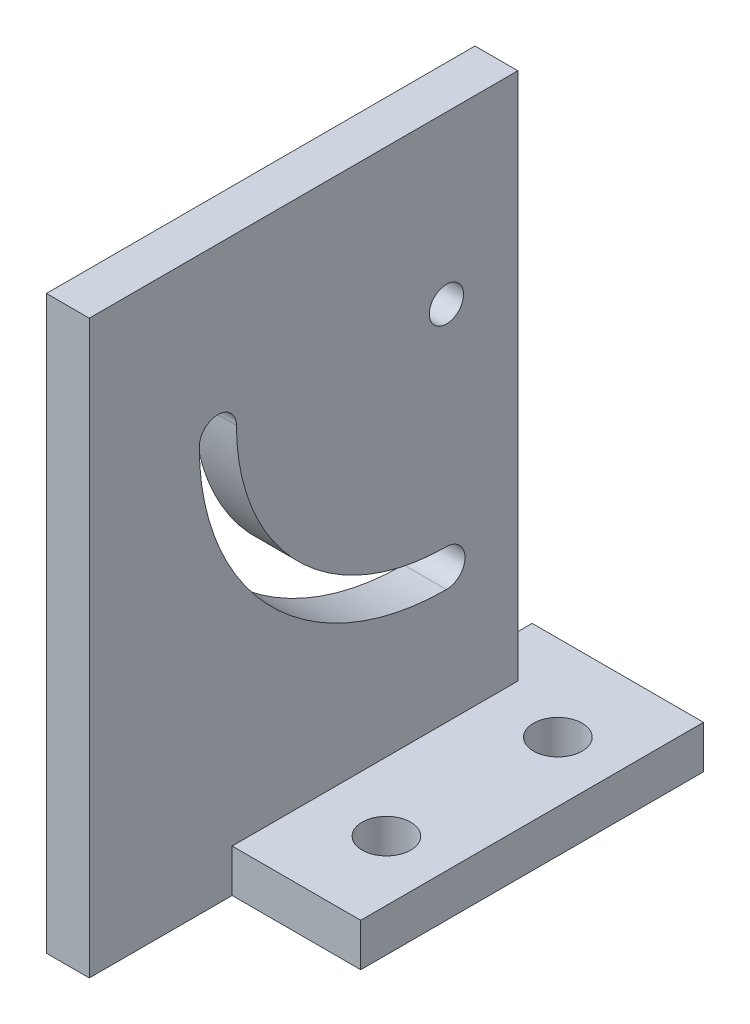
ISO-10303-21;
HEADER;
FILE_DESCRIPTION(('STEP AP214'),'2;1');
FILE_NAME('part.step','',(''),(''),'','','');
FILE_SCHEMA(('AUTOMOTIVE_DESIGN { 1 0 10303 214 1 1 1 1 }'));
ENDSEC;
DATA;
#1=APPLICATION_CONTEXT('core data for automotive mechanical design processes');
#2=APPLICATION_PROTOCOL_DEFINITION('international standard','automotive_design',2000,#1);
#3=PRODUCT_CONTEXT('',#1,'mechanical');
#4=PRODUCT('Part','Part','',(#3));
#5=PRODUCT_RELATED_PRODUCT_CATEGORY('part','',(#4));
#6=PRODUCT_DEFINITION_FORMATION('','',#4);
#7=PRODUCT_DEFINITION_CONTEXT('part definition',#1,'design');
#8=PRODUCT_DEFINITION('design','',#6,#7);
#9=PRODUCT_DEFINITION_SHAPE('','',#8);
#10=(LENGTH_UNIT() NAMED_UNIT(*) SI_UNIT(.MILLI.,.METRE.));
#11=(NAMED_UNIT(*) PLANE_ANGLE_UNIT() SI_UNIT($,.RADIAN.));
#12=(NAMED_UNIT(*) SI_UNIT($,.STERADIAN.) SOLID_ANGLE_UNIT());
#13=UNCERTAINTY_MEASURE_WITH_UNIT(LENGTH_MEASURE(1.E-05),#10,'distance_accuracy_value','');
#14=(GEOMETRIC_REPRESENTATION_CONTEXT(3) GLOBAL_UNCERTAINTY_ASSIGNED_CONTEXT((#13)) GLOBAL_UNIT_ASSIGNED_CONTEXT((#10,
#11,#12)) REPRESENTATION_CONTEXT('',''));
#15=CARTESIAN_POINT('',(0.,0.,0.));
#16=DIRECTION('',(0.,0.,1.));
#17=DIRECTION('',(1.,0.,0.));
#18=AXIS2_PLACEMENT_3D('',#15,#16,#17);
#19=CARTESIAN_POINT('',(18.,-13.,14.));
#20=DIRECTION('',(0.,1.,0.));
#21=DIRECTION('',(1.,0.,0.));
#22=AXIS2_PLACEMENT_3D('',#19,#20,#21);
#23=CYLINDRICAL_SURFACE('',#22,1.7);
#24=CARTESIAN_POINT('',(18.,-15.,14.));
#25=DIRECTION('',(0.,1.,0.));
#26=DIRECTION('',(1.,0.,0.));
#27=AXIS2_PLACEMENT_3D('',#24,#25,#26);
#28=CIRCLE('',#27,1.7);
#29=CARTESIAN_POINT('',(19.7,-15.,14.));
#30=VERTEX_POINT('',#29);
#31=EDGE_CURVE('E266',#30,#30,#28,.T.);
#32=ORIENTED_EDGE('',*,*,#31,.T.);
#33=DIRECTION('',(0.,-1.,0.));
#34=VECTOR('',#33,1.);
#35=CARTESIAN_POINT('',(19.7,-13.,14.));
#36=LINE('',#35,#34);
#37=CARTESIAN_POINT('',(19.7,-18.,14.));
#38=VERTEX_POINT('',#37);
#39=EDGE_CURVE('E9',#30,#38,#36,.T.);
#40=ORIENTED_EDGE('',*,*,#39,.T.);
#41=CARTESIAN_POINT('',(18.,-18.,14.));
#42=DIRECTION('',(0.,1.,0.));
#43=DIRECTION('',(1.,0.,0.));
#44=AXIS2_PLACEMENT_3D('',#41,#42,#43);
#45=CIRCLE('',#44,1.7);
#46=EDGE_CURVE('E217',#38,#38,#45,.T.);
#47=ORIENTED_EDGE('',*,*,#46,.F.);
#48=ORIENTED_EDGE('',*,*,#39,.F.);
#49=EDGE_LOOP('',(#32,#40,#47,#48));
#50=FACE_BOUND('',#49,.T.);
#51=ADVANCED_FACE('F15',(#50),#23,.F.);
#52=CARTESIAN_POINT('',(18.,-13.,2.));
#53=DIRECTION('',(0.,1.,0.));
#54=DIRECTION('',(1.,0.,0.));
#55=AXIS2_PLACEMENT_3D('',#52,#53,#54);
#56=CYLINDRICAL_SURFACE('',#55,1.7);
#57=CARTESIAN_POINT('',(18.,-15.,2.));
#58=DIRECTION('',(0.,1.,0.));
#59=DIRECTION('',(1.,0.,0.));
#60=AXIS2_PLACEMENT_3D('',#57,#58,#59);
#61=CIRCLE('',#60,1.7);
#62=CARTESIAN_POINT('',(19.7,-15.,2.));
#63=VERTEX_POINT('',#62);
#64=EDGE_CURVE('E262',#63,#63,#61,.T.);
#65=ORIENTED_EDGE('',*,*,#64,.T.);
#66=DIRECTION('',(0.,-1.,0.));
#67=VECTOR('',#66,1.);
#68=CARTESIAN_POINT('',(19.7,-13.,2.));
#69=LINE('',#68,#67);
#70=CARTESIAN_POINT('',(19.7,-18.,2.));
#71=VERTEX_POINT('',#70);
#72=EDGE_CURVE('E23',#63,#71,#69,.T.);
#73=ORIENTED_EDGE('',*,*,#72,.T.);
#74=CARTESIAN_POINT('',(18.,-18.,2.));
#75=DIRECTION('',(0.,1.,0.));
#76=DIRECTION('',(1.,0.,0.));
#77=AXIS2_PLACEMENT_3D('',#74,#75,#76);
#78=CIRCLE('',#77,1.7);
#79=EDGE_CURVE('E213',#71,#71,#78,.T.);
#80=ORIENTED_EDGE('',*,*,#79,.F.);
#81=ORIENTED_EDGE('',*,*,#72,.F.);
#82=EDGE_LOOP('',(#65,#73,#80,#81));
#83=FACE_BOUND('',#82,.T.);
#84=ADVANCED_FACE('F299',(#83),#56,.F.);
#85=CARTESIAN_POINT('',(22.2,-18.,-4.));
#86=DIRECTION('',(1.,0.,0.));
#87=DIRECTION('',(0.,1.,0.));
#88=AXIS2_PLACEMENT_3D('',#85,#86,#87);
#89=PLANE('',#88);
#90=DIRECTION('',(0.,0.,1.));
#91=VECTOR('',#90,1.);
#92=CARTESIAN_POINT('',(22.2,-18.,-4.));
#93=LINE('',#92,#91);
#94=CARTESIAN_POINT('',(22.2,-18.,-4.));
#95=VERTEX_POINT('',#94);
#96=CARTESIAN_POINT('',(22.2,-18.,20.));
#97=VERTEX_POINT('',#96);
#98=EDGE_CURVE('E202',#95,#97,#93,.T.);
#99=ORIENTED_EDGE('',*,*,#98,.F.);
#100=DIRECTION('',(0.,1.,0.));
#101=VECTOR('',#100,1.);
#102=CARTESIAN_POINT('',(22.2,-18.,-4.));
#103=LINE('',#102,#101);
#104=CARTESIAN_POINT('',(22.2,-15.,-4.));
#105=VERTEX_POINT('',#104);
#106=EDGE_CURVE('E230',#95,#105,#103,.T.);
#107=ORIENTED_EDGE('',*,*,#106,.T.);
#108=DIRECTION('',(0.,0.,1.));
#109=VECTOR('',#108,1.);
#110=CARTESIAN_POINT('',(22.2,-15.,-4.));
#111=LINE('',#110,#109);
#112=CARTESIAN_POINT('',(22.2,-15.,20.));
#113=VERTEX_POINT('',#112);
#114=EDGE_CURVE('E247',#105,#113,#111,.T.);
#115=ORIENTED_EDGE('',*,*,#114,.T.);
#116=DIRECTION('',(0.,1.,0.));
#117=VECTOR('',#116,1.);
#118=CARTESIAN_POINT('',(22.2,-18.,20.));
#119=LINE('',#118,#117);
#120=EDGE_CURVE('E293',#97,#113,#119,.T.);
#121=ORIENTED_EDGE('',*,*,#120,.F.);
#122=EDGE_LOOP('',(#99,#107,#115,#121));
#123=FACE_BOUND('',#122,.T.);
#124=ADVANCED_FACE('F367',(#123),#89,.T.);
#125=CARTESIAN_POINT('',(10.2,-18.,20.));
#126=DIRECTION('',(0.,0.,1.));
#127=DIRECTION('',(1.,0.,0.));
#128=AXIS2_PLACEMENT_3D('',#125,#126,#127);
#129=PLANE('',#128);
#130=DIRECTION('',(1.,0.,0.));
#131=VECTOR('',#130,1.);
#132=CARTESIAN_POINT('',(10.2,-15.,20.));
#133=LINE('',#132,#131);
#134=CARTESIAN_POINT('',(13.2,-15.,20.));
#135=VERTEX_POINT('',#134);
#136=EDGE_CURVE('E258',#135,#113,#133,.T.);
#137=ORIENTED_EDGE('',*,*,#136,.F.);
#138=DIRECTION('',(0.,-1.,0.));
#139=VECTOR('',#138,1.);
#140=CARTESIAN_POINT('',(13.2,-18.,20.));
#141=LINE('',#140,#139);
#142=CARTESIAN_POINT('',(13.2,-18.,20.));
#143=VERTEX_POINT('',#142);
#144=EDGE_CURVE('E290',#135,#143,#141,.T.);
#145=ORIENTED_EDGE('',*,*,#144,.T.);
#146=DIRECTION('',(1.,0.,0.));
#147=VECTOR('',#146,1.);
#148=CARTESIAN_POINT('',(10.2,-18.,20.));
#149=LINE('',#148,#147);
#150=EDGE_CURVE('E197',#143,#97,#149,.T.);
#151=ORIENTED_EDGE('',*,*,#150,.T.);
#152=ORIENTED_EDGE('',*,*,#120,.T.);
#153=EDGE_LOOP('',(#137,#145,#151,#152));
#154=FACE_BOUND('',#153,.T.);
#155=ADVANCED_FACE('F370',(#154),#129,.T.);
#156=CARTESIAN_POINT('',(13.2,-18.,0.));
#157=DIRECTION('',(1.,0.,0.));
#158=DIRECTION('',(0.,1.,0.));
#159=AXIS2_PLACEMENT_3D('',#156,#157,#158);
#160=PLANE('',#159);
#161=CARTESIAN_POINT('',(13.2,-5.65,5.));
#162=DIRECTION('',(-1.,0.,0.));
#163=DIRECTION('',(0.,1.,0.));
#164=AXIS2_PLACEMENT_3D('',#161,#162,#163);
#165=CIRCLE('',#164,1.3);
#166=CARTESIAN_POINT('',(13.2,-4.35,5.));
#167=VERTEX_POINT('',#166);
#168=CARTESIAN_POINT('',(13.2,-6.95,5.));
#169=VERTEX_POINT('',#168);
#170=EDGE_CURVE('E281',#167,#169,#165,.T.);
#171=ORIENTED_EDGE('',*,*,#170,.T.);
#172=CARTESIAN_POINT('',(13.2,10.35,5.));
#173=DIRECTION('',(-1.,0.,0.));
#174=DIRECTION('',(0.,0.,1.));
#175=AXIS2_PLACEMENT_3D('',#172,#173,#174);
#176=CIRCLE('',#175,17.3);
#177=CARTESIAN_POINT('',(13.2,10.35,22.3));
#178=VERTEX_POINT('',#177);
#179=EDGE_CURVE('E35',#169,#178,#176,.T.);
#180=ORIENTED_EDGE('',*,*,#179,.T.);
#181=CARTESIAN_POINT('',(13.2,10.35,21.));
#182=DIRECTION('',(-1.,0.,0.));
#183=DIRECTION('',(0.,1.,0.));
#184=AXIS2_PLACEMENT_3D('',#181,#182,#183);
#185=CIRCLE('',#184,1.3);
#186=CARTESIAN_POINT('',(13.2,10.35,19.7));
#187=VERTEX_POINT('',#186);
#188=EDGE_CURVE('E42',#178,#187,#185,.T.);
#189=ORIENTED_EDGE('',*,*,#188,.T.);
#190=CARTESIAN_POINT('',(13.2,10.35,5.));
#191=DIRECTION('',(-1.,0.,0.));
#192=DIRECTION('',(0.,-1.,0.));
#193=AXIS2_PLACEMENT_3D('',#190,#191,#192);
#194=CIRCLE('',#193,14.7);
#195=EDGE_CURVE('E162',#167,#187,#194,.T.);
#196=ORIENTED_EDGE('',*,*,#195,.F.);
#197=EDGE_LOOP('',(#171,#180,#189,#196));
#198=FACE_BOUND('',#197,.T.);
#199=CARTESIAN_POINT('',(13.2,10.35,5.));
#200=DIRECTION('',(-1.,0.,0.));
#201=DIRECTION('',(0.,1.,0.));
#202=AXIS2_PLACEMENT_3D('',#199,#200,#201);
#203=CIRCLE('',#202,1.2);
#204=CARTESIAN_POINT('',(13.2,11.55,5.));
#205=VERTEX_POINT('',#204);
#206=EDGE_CURVE('E222',#205,#205,#203,.T.);
#207=ORIENTED_EDGE('',*,*,#206,.T.);
#208=EDGE_LOOP('',(#207));
#209=FACE_BOUND('',#208,.T.);
#210=DIRECTION('',(0.,0.,1.));
#211=VECTOR('',#210,1.);
#212=CARTESIAN_POINT('',(13.2,-18.,0.));
#213=LINE('',#212,#211);
#214=CARTESIAN_POINT('',(13.2,-18.,30.));
#215=VERTEX_POINT('',#214);
#216=EDGE_CURVE('E201',#143,#215,#213,.T.);
#217=ORIENTED_EDGE('',*,*,#216,.F.);
#218=ORIENTED_EDGE('',*,*,#144,.F.);
#219=DIRECTION('',(0.,0.,1.));
#220=VECTOR('',#219,1.);
#221=CARTESIAN_POINT('',(13.2,-15.,-2.));
#222=LINE('',#221,#220);
#223=CARTESIAN_POINT('',(13.2,-15.,0.));
#224=VERTEX_POINT('',#223);
#225=EDGE_CURVE('E254',#224,#135,#222,.T.);
#226=ORIENTED_EDGE('',*,*,#225,.F.);
#227=DIRECTION('',(0.,1.,0.));
#228=VECTOR('',#227,1.);
#229=CARTESIAN_POINT('',(13.2,-18.,0.));
#230=LINE('',#229,#228);
#231=CARTESIAN_POINT('',(13.2,22.,0.));
#232=VERTEX_POINT('',#231);
#233=EDGE_CURVE('E237',#224,#232,#230,.T.);
#234=ORIENTED_EDGE('',*,*,#233,.T.);
#235=DIRECTION('',(0.,0.,1.));
#236=VECTOR('',#235,1.);
#237=CARTESIAN_POINT('',(13.2,22.,0.));
#238=LINE('',#237,#236);
#239=CARTESIAN_POINT('',(13.2,22.,30.));
#240=VERTEX_POINT('',#239);
#241=EDGE_CURVE('E234',#232,#240,#238,.T.);
#242=ORIENTED_EDGE('',*,*,#241,.T.);
#243=DIRECTION('',(0.,1.,0.));
#244=VECTOR('',#243,1.);
#245=CARTESIAN_POINT('',(13.2,-18.,30.));
#246=LINE('',#245,#244);
#247=EDGE_CURVE('E242',#215,#240,#246,.T.);
#248=ORIENTED_EDGE('',*,*,#247,.F.);
#249=EDGE_LOOP('',(#217,#218,#226,#234,#242,#248));
#250=FACE_BOUND('',#249,.T.);
#251=ADVANCED_FACE('F339',(#198,#209,#250),#160,.T.);
#252=CARTESIAN_POINT('',(8.7,10.35,5.));
#253=DIRECTION('',(-1.,0.,0.));
#254=DIRECTION('',(0.,0.,1.));
#255=AXIS2_PLACEMENT_3D('',#252,#253,#254);
#256=CYLINDRICAL_SURFACE('',#255,17.3);
#257=CARTESIAN_POINT('',(10.2,10.35,5.));
#258=DIRECTION('',(-1.,0.,0.));
#259=DIRECTION('',(0.,0.,1.));
#260=AXIS2_PLACEMENT_3D('',#257,#258,#259);
#261=CIRCLE('',#260,17.3);
#262=CARTESIAN_POINT('',(10.2,-6.95,5.));
#263=VERTEX_POINT('',#262);
#264=CARTESIAN_POINT('',(10.2,10.35,22.3));
#265=VERTEX_POINT('',#264);
#266=EDGE_CURVE('E174',#263,#265,#261,.T.);
#267=ORIENTED_EDGE('',*,*,#266,.T.);
#268=DIRECTION('',(1.,0.,0.));
#269=VECTOR('',#268,1.);
#270=CARTESIAN_POINT('',(8.7,10.35,22.3));
#271=LINE('',#270,#269);
#272=EDGE_CURVE('E169',#265,#178,#271,.T.);
#273=ORIENTED_EDGE('',*,*,#272,.T.);
#274=ORIENTED_EDGE('',*,*,#179,.F.);
#275=DIRECTION('',(1.,0.,0.));
#276=VECTOR('',#275,1.);
#277=CARTESIAN_POINT('',(8.7,-6.95,5.));
#278=LINE('',#277,#276);
#279=EDGE_CURVE('E233',#263,#169,#278,.T.);
#280=ORIENTED_EDGE('',*,*,#279,.F.);
#281=EDGE_LOOP('',(#267,#273,#274,#280));
#282=FACE_BOUND('',#281,.T.);
#283=ADVANCED_FACE('F378',(#282),#256,.F.);
#284=CARTESIAN_POINT('',(8.7,10.35,21.));
#285=DIRECTION('',(-1.,0.,0.));
#286=DIRECTION('',(0.,1.,0.));
#287=AXIS2_PLACEMENT_3D('',#284,#285,#286);
#288=CYLINDRICAL_SURFACE('',#287,1.3);
#289=CARTESIAN_POINT('',(10.2,10.35,21.));
#290=DIRECTION('',(-1.,0.,0.));
#291=DIRECTION('',(0.,1.,0.));
#292=AXIS2_PLACEMENT_3D('',#289,#290,#291);
#293=CIRCLE('',#292,1.3);
#294=CARTESIAN_POINT('',(10.2,10.35,19.7));
#295=VERTEX_POINT('',#294);
#296=EDGE_CURVE('E167',#265,#295,#293,.T.);
#297=ORIENTED_EDGE('',*,*,#296,.T.);
#298=DIRECTION('',(1.,0.,0.));
#299=VECTOR('',#298,1.);
#300=CARTESIAN_POINT('',(8.7,10.35,19.7));
#301=LINE('',#300,#299);
#302=EDGE_CURVE('E156',#295,#187,#301,.T.);
#303=ORIENTED_EDGE('',*,*,#302,.T.);
#304=ORIENTED_EDGE('',*,*,#188,.F.);
#305=ORIENTED_EDGE('',*,*,#272,.F.);
#306=EDGE_LOOP('',(#297,#303,#304,#305));
#307=FACE_BOUND('',#306,.T.);
#308=ADVANCED_FACE('F168',(#307),#288,.F.);
#309=CARTESIAN_POINT('',(8.7,10.35,5.));
#310=DIRECTION('',(-1.,0.,0.));
#311=DIRECTION('',(0.,-1.,0.));
#312=AXIS2_PLACEMENT_3D('',#309,#310,#311);
#313=CYLINDRICAL_SURFACE('',#312,14.7);
#314=CARTESIAN_POINT('',(10.2,10.35,5.));
#315=DIRECTION('',(-1.,0.,0.));
#316=DIRECTION('',(0.,-1.,0.));
#317=AXIS2_PLACEMENT_3D('',#314,#315,#316);
#318=CIRCLE('',#317,14.7);
#319=CARTESIAN_POINT('',(10.2,-4.35,5.));
#320=VERTEX_POINT('',#319);
#321=EDGE_CURVE('E161',#320,#295,#318,.T.);
#322=ORIENTED_EDGE('',*,*,#321,.F.);
#323=DIRECTION('',(1.,0.,0.));
#324=VECTOR('',#323,1.);
#325=CARTESIAN_POINT('',(8.7,-4.35,5.));
#326=LINE('',#325,#324);
#327=EDGE_CURVE('E225',#320,#167,#326,.T.);
#328=ORIENTED_EDGE('',*,*,#327,.T.);
#329=ORIENTED_EDGE('',*,*,#195,.T.);
#330=ORIENTED_EDGE('',*,*,#302,.F.);
#331=EDGE_LOOP('',(#322,#328,#329,#330));
#332=FACE_BOUND('',#331,.T.);
#333=ADVANCED_FACE('F158',(#332),#313,.T.);
#334=CARTESIAN_POINT('',(8.7,-5.65,5.));
#335=DIRECTION('',(-1.,0.,0.));
#336=DIRECTION('',(0.,1.,0.));
#337=AXIS2_PLACEMENT_3D('',#334,#335,#336);
#338=CYLINDRICAL_SURFACE('',#337,1.3);
#339=ORIENTED_EDGE('',*,*,#327,.F.);
#340=CARTESIAN_POINT('',(10.2,-5.65,5.));
#341=DIRECTION('',(-1.,0.,0.));
#342=DIRECTION('',(0.,1.,0.));
#343=AXIS2_PLACEMENT_3D('',#340,#341,#342);
#344=CIRCLE('',#343,1.3);
#345=EDGE_CURVE('E180',#320,#263,#344,.T.);
#346=ORIENTED_EDGE('',*,*,#345,.T.);
#347=ORIENTED_EDGE('',*,*,#279,.T.);
#348=ORIENTED_EDGE('',*,*,#170,.F.);
#349=EDGE_LOOP('',(#339,#346,#347,#348));
#350=FACE_BOUND('',#349,.T.);
#351=ADVANCED_FACE('F405',(#350),#338,.F.);
#352=CARTESIAN_POINT('',(8.7,10.35,5.));
#353=DIRECTION('',(-1.,0.,0.));
#354=DIRECTION('',(0.,1.,0.));
#355=AXIS2_PLACEMENT_3D('',#352,#353,#354);
#356=CYLINDRICAL_SURFACE('',#355,1.2);
#357=CARTESIAN_POINT('',(10.2,10.35,5.));
#358=DIRECTION('',(-1.,0.,0.));
#359=DIRECTION('',(0.,1.,0.));
#360=AXIS2_PLACEMENT_3D('',#357,#358,#359);
#361=CIRCLE('',#360,1.2);
#362=CARTESIAN_POINT('',(10.2,11.55,5.));
#363=VERTEX_POINT('',#362);
#364=EDGE_CURVE('E182',#363,#363,#361,.T.);
#365=ORIENTED_EDGE('',*,*,#364,.T.);
#366=DIRECTION('',(1.,0.,0.));
#367=VECTOR('',#366,1.);
#368=CARTESIAN_POINT('',(8.7,11.55,5.));
#369=LINE('',#368,#367);
#370=EDGE_CURVE('E226',#363,#205,#369,.T.);
#371=ORIENTED_EDGE('',*,*,#370,.T.);
#372=ORIENTED_EDGE('',*,*,#206,.F.);
#373=ORIENTED_EDGE('',*,*,#370,.F.);
#374=EDGE_LOOP('',(#365,#371,#372,#373));
#375=FACE_BOUND('',#374,.T.);
#376=ADVANCED_FACE('F402',(#375),#356,.F.);
#377=CARTESIAN_POINT('',(10.2,-18.,0.));
#378=DIRECTION('',(0.,0.,1.));
#379=DIRECTION('',(1.,0.,0.));
#380=AXIS2_PLACEMENT_3D('',#377,#378,#379);
#381=PLANE('',#380);
#382=DIRECTION('',(1.,0.,0.));
#383=VECTOR('',#382,1.);
#384=CARTESIAN_POINT('',(10.2,22.,0.));
#385=LINE('',#384,#383);
#386=CARTESIAN_POINT('',(10.2,22.,0.));
#387=VERTEX_POINT('',#386);
#388=EDGE_CURVE('E238',#387,#232,#385,.T.);
#389=ORIENTED_EDGE('',*,*,#388,.T.);
#390=ORIENTED_EDGE('',*,*,#233,.F.);
#391=DIRECTION('',(-1.,0.,0.));
#392=VECTOR('',#391,1.);
#393=CARTESIAN_POINT('',(10.2,-15.,0.));
#394=LINE('',#393,#392);
#395=CARTESIAN_POINT('',(10.2,-15.,0.));
#396=VERTEX_POINT('',#395);
#397=EDGE_CURVE('E251',#224,#396,#394,.T.);
#398=ORIENTED_EDGE('',*,*,#397,.T.);
#399=DIRECTION('',(0.,1.,0.));
#400=VECTOR('',#399,1.);
#401=CARTESIAN_POINT('',(10.2,-18.,0.));
#402=LINE('',#401,#400);
#403=EDGE_CURVE('E327',#396,#387,#402,.T.);
#404=ORIENTED_EDGE('',*,*,#403,.T.);
#405=EDGE_LOOP('',(#389,#390,#398,#404));
#406=FACE_BOUND('',#405,.T.);
#407=ADVANCED_FACE('F361',(#406),#381,.F.);
#408=CARTESIAN_POINT('',(10.2,22.,0.));
#409=DIRECTION('',(0.,1.,0.));
#410=DIRECTION('',(1.,0.,0.));
#411=AXIS2_PLACEMENT_3D('',#408,#409,#410);
#412=PLANE('',#411);
#413=ORIENTED_EDGE('',*,*,#388,.F.);
#414=DIRECTION('',(0.,0.,1.));
#415=VECTOR('',#414,1.);
#416=CARTESIAN_POINT('',(10.2,22.,0.));
#417=LINE('',#416,#415);
#418=CARTESIAN_POINT('',(10.2,22.,30.));
#419=VERTEX_POINT('',#418);
#420=EDGE_CURVE('E346',#387,#419,#417,.T.);
#421=ORIENTED_EDGE('',*,*,#420,.T.);
#422=DIRECTION('',(1.,0.,0.));
#423=VECTOR('',#422,1.);
#424=CARTESIAN_POINT('',(10.2,22.,30.));
#425=LINE('',#424,#423);
#426=EDGE_CURVE('E243',#419,#240,#425,.T.);
#427=ORIENTED_EDGE('',*,*,#426,.T.);
#428=ORIENTED_EDGE('',*,*,#241,.F.);
#429=EDGE_LOOP('',(#413,#421,#427,#428));
#430=FACE_BOUND('',#429,.T.);
#431=ADVANCED_FACE('F344',(#430),#412,.T.);
#432=CARTESIAN_POINT('',(10.2,-15.,-4.));
#433=DIRECTION('',(0.,1.,0.));
#434=DIRECTION('',(1.,0.,0.));
#435=AXIS2_PLACEMENT_3D('',#432,#433,#434);
#436=PLANE('',#435);
#437=ORIENTED_EDGE('',*,*,#31,.F.);
#438=EDGE_LOOP('',(#437));
#439=FACE_BOUND('',#438,.T.);
#440=ORIENTED_EDGE('',*,*,#64,.F.);
#441=EDGE_LOOP('',(#440));
#442=FACE_BOUND('',#441,.T.);
#443=ORIENTED_EDGE('',*,*,#114,.F.);
#444=DIRECTION('',(1.,0.,0.));
#445=VECTOR('',#444,1.);
#446=CARTESIAN_POINT('',(10.2,-15.,-4.));
#447=LINE('',#446,#445);
#448=CARTESIAN_POINT('',(10.2,-15.,-4.));
#449=VERTEX_POINT('',#448);
#450=EDGE_CURVE('E221',#449,#105,#447,.T.);
#451=ORIENTED_EDGE('',*,*,#450,.F.);
#452=DIRECTION('',(0.,0.,1.));
#453=VECTOR('',#452,1.);
#454=CARTESIAN_POINT('',(10.2,-15.,-4.));
#455=LINE('',#454,#453);
#456=EDGE_CURVE('E321',#449,#396,#455,.T.);
#457=ORIENTED_EDGE('',*,*,#456,.T.);
#458=ORIENTED_EDGE('',*,*,#397,.F.);
#459=ORIENTED_EDGE('',*,*,#225,.T.);
#460=ORIENTED_EDGE('',*,*,#136,.T.);
#461=EDGE_LOOP('',(#443,#451,#457,#458,#459,#460));
#462=FACE_BOUND('',#461,.T.);
#463=ADVANCED_FACE('F364',(#439,#442,#462),#436,.T.);
#464=CARTESIAN_POINT('',(10.2,-18.,30.));
#465=DIRECTION('',(0.,0.,1.));
#466=DIRECTION('',(1.,0.,0.));
#467=AXIS2_PLACEMENT_3D('',#464,#465,#466);
#468=PLANE('',#467);
#469=DIRECTION('',(0.,1.,0.));
#470=VECTOR('',#469,1.);
#471=CARTESIAN_POINT('',(10.2,-18.,30.));
#472=LINE('',#471,#470);
#473=CARTESIAN_POINT('',(10.2,-18.,30.));
#474=VERTEX_POINT('',#473);
#475=EDGE_CURVE('E349',#474,#419,#472,.T.);
#476=ORIENTED_EDGE('',*,*,#475,.F.);
#477=DIRECTION('',(1.,0.,0.));
#478=VECTOR('',#477,1.);
#479=CARTESIAN_POINT('',(10.2,-18.,30.));
#480=LINE('',#479,#478);
#481=EDGE_CURVE('E212',#474,#215,#480,.T.);
#482=ORIENTED_EDGE('',*,*,#481,.T.);
#483=ORIENTED_EDGE('',*,*,#247,.T.);
#484=ORIENTED_EDGE('',*,*,#426,.F.);
#485=EDGE_LOOP('',(#476,#482,#483,#484));
#486=FACE_BOUND('',#485,.T.);
#487=ADVANCED_FACE('F335',(#486),#468,.T.);
#488=CARTESIAN_POINT('',(10.2,-18.,-4.));
#489=DIRECTION('',(0.,0.,1.));
#490=DIRECTION('',(1.,0.,0.));
#491=AXIS2_PLACEMENT_3D('',#488,#489,#490);
#492=PLANE('',#491);
#493=ORIENTED_EDGE('',*,*,#450,.T.);
#494=ORIENTED_EDGE('',*,*,#106,.F.);
#495=DIRECTION('',(1.,0.,0.));
#496=VECTOR('',#495,1.);
#497=CARTESIAN_POINT('',(10.2,-18.,-4.));
#498=LINE('',#497,#496);
#499=CARTESIAN_POINT('',(10.2,-18.,-4.));
#500=VERTEX_POINT('',#499);
#501=EDGE_CURVE('E196',#500,#95,#498,.T.);
#502=ORIENTED_EDGE('',*,*,#501,.F.);
#503=DIRECTION('',(0.,1.,0.));
#504=VECTOR('',#503,1.);
#505=CARTESIAN_POINT('',(10.2,-18.,-4.));
#506=LINE('',#505,#504);
#507=EDGE_CURVE('E316',#500,#449,#506,.T.);
#508=ORIENTED_EDGE('',*,*,#507,.T.);
#509=EDGE_LOOP('',(#493,#494,#502,#508));
#510=FACE_BOUND('',#509,.T.);
#511=ADVANCED_FACE('F305',(#510),#492,.F.);
#512=CARTESIAN_POINT('',(10.2,-18.,0.));
#513=DIRECTION('',(0.,1.,0.));
#514=DIRECTION('',(1.,0.,0.));
#515=AXIS2_PLACEMENT_3D('',#512,#513,#514);
#516=PLANE('',#515);
#517=ORIENTED_EDGE('',*,*,#46,.T.);
#518=EDGE_LOOP('',(#517));
#519=FACE_BOUND('',#518,.T.);
#520=ORIENTED_EDGE('',*,*,#79,.T.);
#521=EDGE_LOOP('',(#520));
#522=FACE_BOUND('',#521,.T.);
#523=DIRECTION('',(0.,0.,1.));
#524=VECTOR('',#523,1.);
#525=CARTESIAN_POINT('',(10.2,-18.,-4.));
#526=LINE('',#525,#524);
#527=EDGE_CURVE('E188',#500,#474,#526,.T.);
#528=ORIENTED_EDGE('',*,*,#527,.F.);
#529=ORIENTED_EDGE('',*,*,#501,.T.);
#530=ORIENTED_EDGE('',*,*,#98,.T.);
#531=ORIENTED_EDGE('',*,*,#150,.F.);
#532=ORIENTED_EDGE('',*,*,#216,.T.);
#533=ORIENTED_EDGE('',*,*,#481,.F.);
#534=EDGE_LOOP('',(#528,#529,#530,#531,#532,#533));
#535=FACE_BOUND('',#534,.T.);
#536=ADVANCED_FACE('F302',(#519,#522,#535),#516,.F.);
#537=CARTESIAN_POINT('',(10.2,-18.,0.));
#538=DIRECTION('',(1.,0.,0.));
#539=DIRECTION('',(0.,1.,0.));
#540=AXIS2_PLACEMENT_3D('',#537,#538,#539);
#541=PLANE('',#540);
#542=ORIENTED_EDGE('',*,*,#321,.T.);
#543=ORIENTED_EDGE('',*,*,#296,.F.);
#544=ORIENTED_EDGE('',*,*,#266,.F.);
#545=ORIENTED_EDGE('',*,*,#345,.F.);
#546=EDGE_LOOP('',(#542,#543,#544,#545));
#547=FACE_BOUND('',#546,.T.);
#548=ORIENTED_EDGE('',*,*,#364,.F.);
#549=EDGE_LOOP('',(#548));
#550=FACE_BOUND('',#549,.T.);
#551=ORIENTED_EDGE('',*,*,#475,.T.);
#552=ORIENTED_EDGE('',*,*,#420,.F.);
#553=ORIENTED_EDGE('',*,*,#403,.F.);
#554=ORIENTED_EDGE('',*,*,#456,.F.);
#555=ORIENTED_EDGE('',*,*,#507,.F.);
#556=ORIENTED_EDGE('',*,*,#527,.T.);
#557=EDGE_LOOP('',(#551,#552,#553,#554,#555,#556));
#558=FACE_BOUND('',#557,.T.);
#559=ADVANCED_FACE('F177',(#547,#550,#558),#541,.F.);
#560=CLOSED_SHELL('',(#51,#84,#124,#155,#251,#283,#308,#333,#351,#376,#407,#431,#463,#487,#511,
#536,#559));
#561=MANIFOLD_SOLID_BREP('B1',#560);
#562=ADVANCED_BREP_SHAPE_REPRESENTATION('',(#18,#561),#14);
#563=SHAPE_DEFINITION_REPRESENTATION(#9,#562);
ENDSEC;
END-ISO-10303-21;
